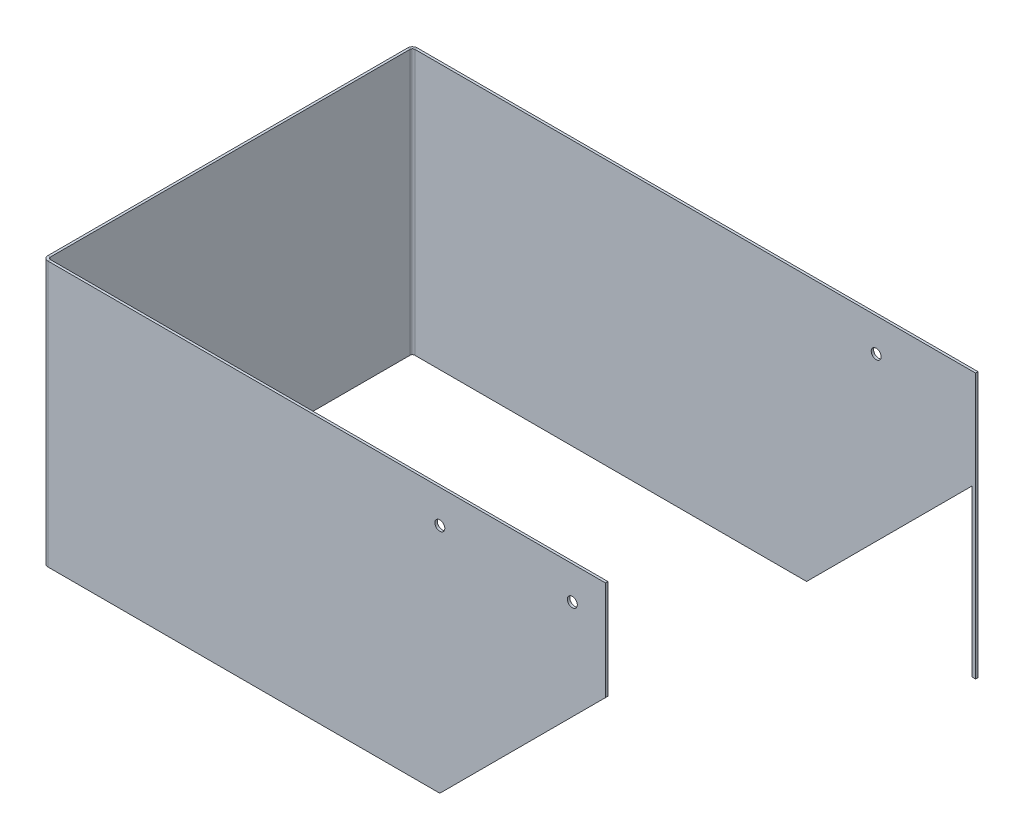
ISO-10303-21;
HEADER;
FILE_DESCRIPTION(('STEP AP214'),'2;1');
FILE_NAME('part.step','',(''),(''),'','','');
FILE_SCHEMA(('AUTOMOTIVE_DESIGN { 1 0 10303 214 1 1 1 1 }'));
ENDSEC;
DATA;
#1=APPLICATION_CONTEXT('core data for automotive mechanical design processes');
#2=APPLICATION_PROTOCOL_DEFINITION('international standard','automotive_design',2000,#1);
#3=PRODUCT_CONTEXT('',#1,'mechanical');
#4=PRODUCT('Part','Part','',(#3));
#5=PRODUCT_RELATED_PRODUCT_CATEGORY('part','',(#4));
#6=PRODUCT_DEFINITION_FORMATION('','',#4);
#7=PRODUCT_DEFINITION_CONTEXT('part definition',#1,'design');
#8=PRODUCT_DEFINITION('design','',#6,#7);
#9=PRODUCT_DEFINITION_SHAPE('','',#8);
#10=(LENGTH_UNIT() NAMED_UNIT(*) SI_UNIT(.MILLI.,.METRE.));
#11=(NAMED_UNIT(*) PLANE_ANGLE_UNIT() SI_UNIT($,.RADIAN.));
#12=(NAMED_UNIT(*) SI_UNIT($,.STERADIAN.) SOLID_ANGLE_UNIT());
#13=UNCERTAINTY_MEASURE_WITH_UNIT(LENGTH_MEASURE(1.E-05),#10,'distance_accuracy_value','');
#14=(GEOMETRIC_REPRESENTATION_CONTEXT(3) GLOBAL_UNCERTAINTY_ASSIGNED_CONTEXT((#13)) GLOBAL_UNIT_ASSIGNED_CONTEXT((#10,
#11,#12)) REPRESENTATION_CONTEXT('',''));
#15=CARTESIAN_POINT('',(0.,0.,0.));
#16=DIRECTION('',(0.,0.,1.));
#17=DIRECTION('',(1.,0.,0.));
#18=AXIS2_PLACEMENT_3D('',#15,#16,#17);
#19=CARTESIAN_POINT('',(-0.7366,0.,-54.3));
#20=DIRECTION('',(0.,-1.,0.));
#21=DIRECTION('',(0.,0.,-1.));
#22=AXIS2_PLACEMENT_3D('',#19,#20,#21);
#23=PLANE('',#22);
#24=DIRECTION('',(0.,0.,1.));
#25=VECTOR('',#24,1.);
#26=CARTESIAN_POINT('',(119.,0.,-55.7366));
#27=LINE('',#26,#25);
#28=CARTESIAN_POINT('',(119.,0.,-55.7366));
#29=VERTEX_POINT('',#28);
#30=CARTESIAN_POINT('',(119.,0.,-55.));
#31=VERTEX_POINT('',#30);
#32=EDGE_CURVE('E152',#29,#31,#27,.T.);
#33=ORIENTED_EDGE('',*,*,#32,.T.);
#34=DIRECTION('',(-1.,0.,0.));
#35=VECTOR('',#34,1.);
#36=CARTESIAN_POINT('',(170.,0.,-55.));
#37=LINE('',#36,#35);
#38=CARTESIAN_POINT('',(0.700000000000006,0.,-55.));
#39=VERTEX_POINT('',#38);
#40=EDGE_CURVE('E282',#31,#39,#37,.T.);
#41=ORIENTED_EDGE('',*,*,#40,.T.);
#42=DIRECTION('',(0.,0.,-1.));
#43=VECTOR('',#42,1.);
#44=CARTESIAN_POINT('',(0.700000000000006,0.,-55.));
#45=LINE('',#44,#43);
#46=CARTESIAN_POINT('',(0.700000000000009,0.,-55.7366));
#47=VERTEX_POINT('',#46);
#48=EDGE_CURVE('E172',#39,#47,#45,.T.);
#49=ORIENTED_EDGE('',*,*,#48,.T.);
#50=DIRECTION('',(-1.,0.,0.));
#51=VECTOR('',#50,1.);
#52=CARTESIAN_POINT('',(170.,0.,-55.7366));
#53=LINE('',#52,#51);
#54=EDGE_CURVE('E166',#29,#47,#53,.T.);
#55=ORIENTED_EDGE('',*,*,#54,.F.);
#56=EDGE_LOOP('',(#33,#41,#49,#55));
#57=FACE_BOUND('',#56,.T.);
#58=ADVANCED_FACE('F41',(#57),#23,.T.);
#59=CARTESIAN_POINT('',(0.,80.,-54.3));
#60=DIRECTION('',(0.,1.,0.));
#61=DIRECTION('',(0.,0.,1.));
#62=AXIS2_PLACEMENT_3D('',#59,#60,#61);
#63=PLANE('',#62);
#64=DIRECTION('',(-1.,0.,0.));
#65=VECTOR('',#64,1.);
#66=CARTESIAN_POINT('',(0.,80.,-54.3));
#67=LINE('',#66,#65);
#68=CARTESIAN_POINT('',(0.,80.,-54.3));
#69=VERTEX_POINT('',#68);
#70=CARTESIAN_POINT('',(-0.7366,80.,-54.3));
#71=VERTEX_POINT('',#70);
#72=EDGE_CURVE('E49',#69,#71,#67,.T.);
#73=ORIENTED_EDGE('',*,*,#72,.F.);
#74=CARTESIAN_POINT('',(0.700000000000003,80.,-54.3));
#75=DIRECTION('',(0.,-1.,0.));
#76=DIRECTION('',(0.,0.,-1.));
#77=AXIS2_PLACEMENT_3D('',#74,#75,#76);
#78=CIRCLE('',#77,0.7);
#79=CARTESIAN_POINT('',(0.700000000000006,80.,-55.));
#80=VERTEX_POINT('',#79);
#81=EDGE_CURVE('E300',#80,#69,#78,.F.);
#82=ORIENTED_EDGE('',*,*,#81,.F.);
#83=DIRECTION('',(0.,0.,1.));
#84=VECTOR('',#83,1.);
#85=CARTESIAN_POINT('',(0.700000000000009,80.,-55.7366));
#86=LINE('',#85,#84);
#87=CARTESIAN_POINT('',(0.700000000000009,80.,-55.7366));
#88=VERTEX_POINT('',#87);
#89=EDGE_CURVE('E237',#88,#80,#86,.T.);
#90=ORIENTED_EDGE('',*,*,#89,.F.);
#91=CARTESIAN_POINT('',(0.700000000000003,80.,-54.3));
#92=DIRECTION('',(0.,1.,0.));
#93=DIRECTION('',(1.,0.,0.));
#94=AXIS2_PLACEMENT_3D('',#91,#92,#93);
#95=CIRCLE('',#94,1.4366);
#96=EDGE_CURVE('E252',#88,#71,#95,.T.);
#97=ORIENTED_EDGE('',*,*,#96,.T.);
#98=EDGE_LOOP('',(#73,#82,#90,#97));
#99=FACE_BOUND('',#98,.T.);
#100=ADVANCED_FACE('F43',(#99),#63,.T.);
#101=CARTESIAN_POINT('',(0.700000000000009,80.,-55.7366));
#102=DIRECTION('',(0.,1.,0.));
#103=DIRECTION('',(0.,0.,1.));
#104=AXIS2_PLACEMENT_3D('',#101,#102,#103);
#105=PLANE('',#104);
#106=DIRECTION('',(0.,0.,1.));
#107=VECTOR('',#106,1.);
#108=CARTESIAN_POINT('',(0.,80.,0.));
#109=LINE('',#108,#107);
#110=CARTESIAN_POINT('',(0.,80.,54.3));
#111=VERTEX_POINT('',#110);
#112=EDGE_CURVE('E247',#69,#111,#109,.T.);
#113=ORIENTED_EDGE('',*,*,#112,.F.);
#114=ORIENTED_EDGE('',*,*,#72,.T.);
#115=DIRECTION('',(0.,0.,1.));
#116=VECTOR('',#115,1.);
#117=CARTESIAN_POINT('',(-0.7366,80.,-55.));
#118=LINE('',#117,#116);
#119=CARTESIAN_POINT('',(-0.736600000000009,80.,54.3));
#120=VERTEX_POINT('',#119);
#121=EDGE_CURVE('E244',#71,#120,#118,.T.);
#122=ORIENTED_EDGE('',*,*,#121,.T.);
#123=DIRECTION('',(1.,0.,0.));
#124=VECTOR('',#123,1.);
#125=CARTESIAN_POINT('',(-0.736600000000009,80.,54.3));
#126=LINE('',#125,#124);
#127=EDGE_CURVE('E230',#120,#111,#126,.T.);
#128=ORIENTED_EDGE('',*,*,#127,.T.);
#129=EDGE_LOOP('',(#113,#114,#122,#128));
#130=FACE_BOUND('',#129,.T.);
#131=ADVANCED_FACE('F242',(#130),#105,.T.);
#132=CARTESIAN_POINT('',(0.700000000000006,0.,-55.));
#133=DIRECTION('',(0.,-1.,0.));
#134=DIRECTION('',(0.,0.,-1.));
#135=AXIS2_PLACEMENT_3D('',#132,#133,#134);
#136=PLANE('',#135);
#137=ORIENTED_EDGE('',*,*,#48,.F.);
#138=CARTESIAN_POINT('',(0.700000000000003,0.,-54.3));
#139=DIRECTION('',(0.,-1.,0.));
#140=DIRECTION('',(0.,0.,-1.));
#141=AXIS2_PLACEMENT_3D('',#138,#139,#140);
#142=CIRCLE('',#141,0.7);
#143=CARTESIAN_POINT('',(0.,0.,-54.3));
#144=VERTEX_POINT('',#143);
#145=EDGE_CURVE('E280',#39,#144,#142,.F.);
#146=ORIENTED_EDGE('',*,*,#145,.T.);
#147=DIRECTION('',(1.,0.,0.));
#148=VECTOR('',#147,1.);
#149=CARTESIAN_POINT('',(-0.7366,0.,-54.3));
#150=LINE('',#149,#148);
#151=CARTESIAN_POINT('',(-0.7366,0.,-54.3));
#152=VERTEX_POINT('',#151);
#153=EDGE_CURVE('E234',#152,#144,#150,.T.);
#154=ORIENTED_EDGE('',*,*,#153,.F.);
#155=CARTESIAN_POINT('',(0.700000000000003,0.,-54.3));
#156=DIRECTION('',(0.,1.,0.));
#157=DIRECTION('',(1.,0.,0.));
#158=AXIS2_PLACEMENT_3D('',#155,#156,#157);
#159=CIRCLE('',#158,1.4366);
#160=EDGE_CURVE('E177',#47,#152,#159,.T.);
#161=ORIENTED_EDGE('',*,*,#160,.F.);
#162=EDGE_LOOP('',(#137,#146,#154,#161));
#163=FACE_BOUND('',#162,.T.);
#164=ADVANCED_FACE('F289',(#163),#136,.T.);
#165=DIRECTION('',(0.,0.,1.));
#166=VECTOR('',#165,1.);
#167=CARTESIAN_POINT('',(169.,0.,-55.7366));
#168=LINE('',#167,#166);
#169=CARTESIAN_POINT('',(169.,0.,-55.7366));
#170=VERTEX_POINT('',#169);
#171=CARTESIAN_POINT('',(169.,0.,-55.));
#172=VERTEX_POINT('',#171);
#173=EDGE_CURVE('E159',#170,#172,#168,.T.);
#174=ORIENTED_EDGE('',*,*,#173,.F.);
#175=CARTESIAN_POINT('',(170.,0.,-55.7366));
#176=VERTEX_POINT('',#175);
#177=EDGE_CURVE('E174',#176,#170,#53,.T.);
#178=ORIENTED_EDGE('',*,*,#177,.F.);
#179=DIRECTION('',(0.,0.,1.));
#180=VECTOR('',#179,1.);
#181=CARTESIAN_POINT('',(170.,0.,-55.7366));
#182=LINE('',#181,#180);
#183=CARTESIAN_POINT('',(170.,0.,-55.));
#184=VERTEX_POINT('',#183);
#185=EDGE_CURVE('E175',#176,#184,#182,.T.);
#186=ORIENTED_EDGE('',*,*,#185,.T.);
#187=EDGE_CURVE('E179',#184,#172,#37,.T.);
#188=ORIENTED_EDGE('',*,*,#187,.T.);
#189=EDGE_LOOP('',(#174,#178,#186,#188));
#190=FACE_BOUND('',#189,.T.);
#191=ADVANCED_FACE('F356',(#190),#23,.T.);
#192=CARTESIAN_POINT('',(0.699999999999992,80.,55.));
#193=DIRECTION('',(0.,1.,0.));
#194=DIRECTION('',(0.,0.,1.));
#195=AXIS2_PLACEMENT_3D('',#192,#193,#194);
#196=PLANE('',#195);
#197=DIRECTION('',(0.,0.,1.));
#198=VECTOR('',#197,1.);
#199=CARTESIAN_POINT('',(0.699999999999992,80.,55.));
#200=LINE('',#199,#198);
#201=CARTESIAN_POINT('',(0.699999999999992,80.,55.));
#202=VERTEX_POINT('',#201);
#203=CARTESIAN_POINT('',(0.699999999999992,80.,55.7366));
#204=VERTEX_POINT('',#203);
#205=EDGE_CURVE('E232',#202,#204,#200,.T.);
#206=ORIENTED_EDGE('',*,*,#205,.F.);
#207=CARTESIAN_POINT('',(0.699999999999992,80.,54.3));
#208=DIRECTION('',(0.,-1.,0.));
#209=DIRECTION('',(0.,0.,-1.));
#210=AXIS2_PLACEMENT_3D('',#207,#208,#209);
#211=CIRCLE('',#210,0.7);
#212=EDGE_CURVE('E323',#111,#202,#211,.F.);
#213=ORIENTED_EDGE('',*,*,#212,.F.);
#214=ORIENTED_EDGE('',*,*,#127,.F.);
#215=CARTESIAN_POINT('',(0.699999999999992,80.,54.3));
#216=DIRECTION('',(0.,1.,0.));
#217=DIRECTION('',(1.,0.,0.));
#218=AXIS2_PLACEMENT_3D('',#215,#216,#217);
#219=CIRCLE('',#218,1.4366);
#220=EDGE_CURVE('E196',#120,#204,#219,.T.);
#221=ORIENTED_EDGE('',*,*,#220,.T.);
#222=EDGE_LOOP('',(#206,#213,#214,#221));
#223=FACE_BOUND('',#222,.T.);
#224=ADVANCED_FACE('F408',(#223),#196,.T.);
#225=CARTESIAN_POINT('',(-0.736600000000009,80.,54.3));
#226=DIRECTION('',(0.,1.,0.));
#227=DIRECTION('',(0.,0.,1.));
#228=AXIS2_PLACEMENT_3D('',#225,#226,#227);
#229=PLANE('',#228);
#230=DIRECTION('',(1.,0.,0.));
#231=VECTOR('',#230,1.);
#232=CARTESIAN_POINT('',(0.,80.,55.));
#233=LINE('',#232,#231);
#234=CARTESIAN_POINT('',(169.,80.,55.));
#235=VERTEX_POINT('',#234);
#236=EDGE_CURVE('E341',#202,#235,#233,.T.);
#237=ORIENTED_EDGE('',*,*,#236,.F.);
#238=ORIENTED_EDGE('',*,*,#205,.T.);
#239=DIRECTION('',(1.,0.,0.));
#240=VECTOR('',#239,1.);
#241=CARTESIAN_POINT('',(0.,80.,55.7366));
#242=LINE('',#241,#240);
#243=CARTESIAN_POINT('',(169.,80.,55.7366));
#244=VERTEX_POINT('',#243);
#245=EDGE_CURVE('E191',#204,#244,#242,.T.);
#246=ORIENTED_EDGE('',*,*,#245,.T.);
#247=DIRECTION('',(0.,0.,1.));
#248=VECTOR('',#247,1.);
#249=CARTESIAN_POINT('',(169.,80.,55.));
#250=LINE('',#249,#248);
#251=EDGE_CURVE('E338',#235,#244,#250,.T.);
#252=ORIENTED_EDGE('',*,*,#251,.F.);
#253=EDGE_LOOP('',(#237,#238,#246,#252));
#254=FACE_BOUND('',#253,.T.);
#255=ADVANCED_FACE('F413',(#254),#229,.T.);
#256=CARTESIAN_POINT('',(0.,0.,54.3));
#257=DIRECTION('',(0.,-1.,0.));
#258=DIRECTION('',(0.,0.,-1.));
#259=AXIS2_PLACEMENT_3D('',#256,#257,#258);
#260=PLANE('',#259);
#261=DIRECTION('',(-1.,0.,0.));
#262=VECTOR('',#261,1.);
#263=CARTESIAN_POINT('',(0.,0.,54.3));
#264=LINE('',#263,#262);
#265=CARTESIAN_POINT('',(0.,0.,54.3));
#266=VERTEX_POINT('',#265);
#267=CARTESIAN_POINT('',(-0.736600000000009,0.,54.3));
#268=VERTEX_POINT('',#267);
#269=EDGE_CURVE('E228',#266,#268,#264,.T.);
#270=ORIENTED_EDGE('',*,*,#269,.F.);
#271=CARTESIAN_POINT('',(0.699999999999992,0.,54.3));
#272=DIRECTION('',(0.,-1.,0.));
#273=DIRECTION('',(0.,0.,-1.));
#274=AXIS2_PLACEMENT_3D('',#271,#272,#273);
#275=CIRCLE('',#274,0.7);
#276=CARTESIAN_POINT('',(0.699999999999992,0.,55.));
#277=VERTEX_POINT('',#276);
#278=EDGE_CURVE('E274',#266,#277,#275,.F.);
#279=ORIENTED_EDGE('',*,*,#278,.T.);
#280=DIRECTION('',(0.,0.,-1.));
#281=VECTOR('',#280,1.);
#282=CARTESIAN_POINT('',(0.699999999999992,0.,55.7366));
#283=LINE('',#282,#281);
#284=CARTESIAN_POINT('',(0.699999999999992,0.,55.7366));
#285=VERTEX_POINT('',#284);
#286=EDGE_CURVE('E226',#285,#277,#283,.T.);
#287=ORIENTED_EDGE('',*,*,#286,.F.);
#288=CARTESIAN_POINT('',(0.699999999999992,0.,54.3));
#289=DIRECTION('',(0.,1.,0.));
#290=DIRECTION('',(1.,0.,0.));
#291=AXIS2_PLACEMENT_3D('',#288,#289,#290);
#292=CIRCLE('',#291,1.4366);
#293=EDGE_CURVE('E188',#268,#285,#292,.T.);
#294=ORIENTED_EDGE('',*,*,#293,.F.);
#295=EDGE_LOOP('',(#270,#279,#287,#294));
#296=FACE_BOUND('',#295,.T.);
#297=ADVANCED_FACE('F313',(#296),#260,.T.);
#298=CARTESIAN_POINT('',(0.699999999999992,0.,55.7366));
#299=DIRECTION('',(0.,-1.,0.));
#300=DIRECTION('',(0.,0.,-1.));
#301=AXIS2_PLACEMENT_3D('',#298,#299,#300);
#302=PLANE('',#301);
#303=DIRECTION('',(0.,0.,1.));
#304=VECTOR('',#303,1.);
#305=CARTESIAN_POINT('',(0.,0.,-55.));
#306=LINE('',#305,#304);
#307=EDGE_CURVE('E277',#144,#266,#306,.T.);
#308=ORIENTED_EDGE('',*,*,#307,.T.);
#309=ORIENTED_EDGE('',*,*,#269,.T.);
#310=DIRECTION('',(0.,0.,1.));
#311=VECTOR('',#310,1.);
#312=CARTESIAN_POINT('',(-0.7366,0.,0.));
#313=LINE('',#312,#311);
#314=EDGE_CURVE('E185',#152,#268,#313,.T.);
#315=ORIENTED_EDGE('',*,*,#314,.F.);
#316=ORIENTED_EDGE('',*,*,#153,.T.);
#317=EDGE_LOOP('',(#308,#309,#315,#316));
#318=FACE_BOUND('',#317,.T.);
#319=ADVANCED_FACE('F306',(#318),#302,.T.);
#320=CARTESIAN_POINT('',(0.,80.,55.7366));
#321=DIRECTION('',(0.,0.,-1.));
#322=DIRECTION('',(-1.,0.,0.));
#323=AXIS2_PLACEMENT_3D('',#320,#321,#322);
#324=PLANE('',#323);
#325=CARTESIAN_POINT('',(159.,70.,55.7366));
#326=DIRECTION('',(0.,0.,1.));
#327=DIRECTION('',(1.,0.,0.));
#328=AXIS2_PLACEMENT_3D('',#325,#326,#327);
#329=CIRCLE('',#328,1.5);
#330=CARTESIAN_POINT('',(160.5,70.,55.7366));
#331=VERTEX_POINT('',#330);
#332=EDGE_CURVE('E369',#331,#331,#329,.T.);
#333=ORIENTED_EDGE('',*,*,#332,.F.);
#334=EDGE_LOOP('',(#333));
#335=FACE_BOUND('',#334,.T.);
#336=CARTESIAN_POINT('',(119.,70.,55.7366));
#337=DIRECTION('',(0.,0.,1.));
#338=DIRECTION('',(1.,0.,0.));
#339=AXIS2_PLACEMENT_3D('',#336,#337,#338);
#340=CIRCLE('',#339,1.5);
#341=CARTESIAN_POINT('',(120.5,70.,55.7366));
#342=VERTEX_POINT('',#341);
#343=EDGE_CURVE('E370',#342,#342,#340,.T.);
#344=ORIENTED_EDGE('',*,*,#343,.F.);
#345=EDGE_LOOP('',(#344));
#346=FACE_BOUND('',#345,.T.);
#347=DIRECTION('',(1.,0.,0.));
#348=VECTOR('',#347,1.);
#349=CARTESIAN_POINT('',(0.,0.,55.7366));
#350=LINE('',#349,#348);
#351=CARTESIAN_POINT('',(119.,0.,55.7366));
#352=VERTEX_POINT('',#351);
#353=EDGE_CURVE('E268',#285,#352,#350,.T.);
#354=ORIENTED_EDGE('',*,*,#353,.T.);
#355=DIRECTION('',(0.707106781186548,0.707106781186548,0.));
#356=VECTOR('',#355,1.);
#357=CARTESIAN_POINT('',(99.5,-19.5,55.7366));
#358=LINE('',#357,#356);
#359=CARTESIAN_POINT('',(169.,50.,55.7366));
#360=VERTEX_POINT('',#359);
#361=EDGE_CURVE('E63',#352,#360,#358,.T.);
#362=ORIENTED_EDGE('',*,*,#361,.T.);
#363=DIRECTION('',(0.,-1.,0.));
#364=VECTOR('',#363,1.);
#365=CARTESIAN_POINT('',(169.,80.,55.7366));
#366=LINE('',#365,#364);
#367=EDGE_CURVE('E223',#244,#360,#366,.T.);
#368=ORIENTED_EDGE('',*,*,#367,.F.);
#369=ORIENTED_EDGE('',*,*,#245,.F.);
#370=DIRECTION('',(0.,-1.,0.));
#371=VECTOR('',#370,1.);
#372=CARTESIAN_POINT('',(0.699999999999992,80.,55.7366));
#373=LINE('',#372,#371);
#374=EDGE_CURVE('E192',#204,#285,#373,.T.);
#375=ORIENTED_EDGE('',*,*,#374,.T.);
#376=EDGE_LOOP('',(#354,#362,#368,#369,#375));
#377=FACE_BOUND('',#376,.T.);
#378=ADVANCED_FACE('F484',(#335,#346,#377),#324,.F.);
#379=CARTESIAN_POINT('',(169.,80.,55.));
#380=DIRECTION('',(1.,0.,0.));
#381=DIRECTION('',(0.,0.,-1.));
#382=AXIS2_PLACEMENT_3D('',#379,#380,#381);
#383=PLANE('',#382);
#384=DIRECTION('',(0.,0.,1.));
#385=VECTOR('',#384,1.);
#386=CARTESIAN_POINT('',(169.,50.,-55.7366));
#387=LINE('',#386,#385);
#388=CARTESIAN_POINT('',(169.,50.,55.));
#389=VERTEX_POINT('',#388);
#390=EDGE_CURVE('E361',#389,#360,#387,.T.);
#391=ORIENTED_EDGE('',*,*,#390,.F.);
#392=DIRECTION('',(0.,-1.,0.));
#393=VECTOR('',#392,1.);
#394=CARTESIAN_POINT('',(169.,80.,55.));
#395=LINE('',#394,#393);
#396=EDGE_CURVE('E220',#235,#389,#395,.T.);
#397=ORIENTED_EDGE('',*,*,#396,.F.);
#398=ORIENTED_EDGE('',*,*,#251,.T.);
#399=ORIENTED_EDGE('',*,*,#367,.T.);
#400=EDGE_LOOP('',(#391,#397,#398,#399));
#401=FACE_BOUND('',#400,.T.);
#402=ADVANCED_FACE('F495',(#401),#383,.T.);
#403=CARTESIAN_POINT('',(0.,80.,55.));
#404=DIRECTION('',(0.,0.,-1.));
#405=DIRECTION('',(-1.,0.,0.));
#406=AXIS2_PLACEMENT_3D('',#403,#404,#405);
#407=PLANE('',#406);
#408=CARTESIAN_POINT('',(159.,70.,55.));
#409=DIRECTION('',(0.,0.,-1.));
#410=DIRECTION('',(-1.,0.,0.));
#411=AXIS2_PLACEMENT_3D('',#408,#409,#410);
#412=CIRCLE('',#411,1.5);
#413=CARTESIAN_POINT('',(157.5,70.,55.));
#414=VERTEX_POINT('',#413);
#415=EDGE_CURVE('E169',#414,#414,#412,.F.);
#416=ORIENTED_EDGE('',*,*,#415,.T.);
#417=EDGE_LOOP('',(#416));
#418=FACE_BOUND('',#417,.T.);
#419=CARTESIAN_POINT('',(119.,70.,55.));
#420=DIRECTION('',(0.,0.,-1.));
#421=DIRECTION('',(-1.,0.,0.));
#422=AXIS2_PLACEMENT_3D('',#419,#420,#421);
#423=CIRCLE('',#422,1.5);
#424=CARTESIAN_POINT('',(117.5,70.,55.));
#425=VERTEX_POINT('',#424);
#426=EDGE_CURVE('E366',#425,#425,#423,.F.);
#427=ORIENTED_EDGE('',*,*,#426,.T.);
#428=EDGE_LOOP('',(#427));
#429=FACE_BOUND('',#428,.T.);
#430=DIRECTION('',(0.707106781186548,0.707106781186548,0.));
#431=VECTOR('',#430,1.);
#432=CARTESIAN_POINT('',(99.5,-19.5,55.));
#433=LINE('',#432,#431);
#434=CARTESIAN_POINT('',(119.,0.,55.));
#435=VERTEX_POINT('',#434);
#436=EDGE_CURVE('E329',#435,#389,#433,.T.);
#437=ORIENTED_EDGE('',*,*,#436,.F.);
#438=DIRECTION('',(1.,0.,0.));
#439=VECTOR('',#438,1.);
#440=CARTESIAN_POINT('',(0.,0.,55.));
#441=LINE('',#440,#439);
#442=EDGE_CURVE('E271',#277,#435,#441,.T.);
#443=ORIENTED_EDGE('',*,*,#442,.F.);
#444=DIRECTION('',(0.,-1.,0.));
#445=VECTOR('',#444,1.);
#446=CARTESIAN_POINT('',(0.699999999999992,80.,55.));
#447=LINE('',#446,#445);
#448=EDGE_CURVE('E217',#202,#277,#447,.T.);
#449=ORIENTED_EDGE('',*,*,#448,.F.);
#450=ORIENTED_EDGE('',*,*,#236,.T.);
#451=ORIENTED_EDGE('',*,*,#396,.T.);
#452=EDGE_LOOP('',(#437,#443,#449,#450,#451));
#453=FACE_BOUND('',#452,.T.);
#454=ADVANCED_FACE('F328',(#418,#429,#453),#407,.T.);
#455=CARTESIAN_POINT('',(0.699999999999992,80.,54.3));
#456=DIRECTION('',(0.,-1.,0.));
#457=DIRECTION('',(0.,0.,-1.));
#458=AXIS2_PLACEMENT_3D('',#455,#456,#457);
#459=CYLINDRICAL_SURFACE('',#458,0.7);
#460=ORIENTED_EDGE('',*,*,#278,.F.);
#461=DIRECTION('',(0.,-1.,0.));
#462=VECTOR('',#461,1.);
#463=CARTESIAN_POINT('',(0.,80.,54.3));
#464=LINE('',#463,#462);
#465=EDGE_CURVE('E214',#111,#266,#464,.T.);
#466=ORIENTED_EDGE('',*,*,#465,.F.);
#467=ORIENTED_EDGE('',*,*,#212,.T.);
#468=ORIENTED_EDGE('',*,*,#448,.T.);
#469=EDGE_LOOP('',(#460,#466,#467,#468));
#470=FACE_BOUND('',#469,.T.);
#471=ADVANCED_FACE('F321',(#470),#459,.F.);
#472=CARTESIAN_POINT('',(0.,80.,-55.));
#473=DIRECTION('',(1.,0.,0.));
#474=DIRECTION('',(0.,0.,-1.));
#475=AXIS2_PLACEMENT_3D('',#472,#473,#474);
#476=PLANE('',#475);
#477=ORIENTED_EDGE('',*,*,#307,.F.);
#478=DIRECTION('',(0.,-1.,0.));
#479=VECTOR('',#478,1.);
#480=CARTESIAN_POINT('',(0.,80.,-54.3));
#481=LINE('',#480,#479);
#482=EDGE_CURVE('E211',#69,#144,#481,.T.);
#483=ORIENTED_EDGE('',*,*,#482,.F.);
#484=ORIENTED_EDGE('',*,*,#112,.T.);
#485=ORIENTED_EDGE('',*,*,#465,.T.);
#486=EDGE_LOOP('',(#477,#483,#484,#485));
#487=FACE_BOUND('',#486,.T.);
#488=ADVANCED_FACE('F302',(#487),#476,.T.);
#489=CARTESIAN_POINT('',(0.700000000000003,80.,-54.3));
#490=DIRECTION('',(0.,-1.,0.));
#491=DIRECTION('',(0.,0.,-1.));
#492=AXIS2_PLACEMENT_3D('',#489,#490,#491);
#493=CYLINDRICAL_SURFACE('',#492,0.7);
#494=ORIENTED_EDGE('',*,*,#145,.F.);
#495=DIRECTION('',(0.,-1.,0.));
#496=VECTOR('',#495,1.);
#497=CARTESIAN_POINT('',(0.700000000000006,80.,-55.));
#498=LINE('',#497,#496);
#499=EDGE_CURVE('E208',#80,#39,#498,.T.);
#500=ORIENTED_EDGE('',*,*,#499,.F.);
#501=ORIENTED_EDGE('',*,*,#81,.T.);
#502=ORIENTED_EDGE('',*,*,#482,.T.);
#503=EDGE_LOOP('',(#494,#500,#501,#502));
#504=FACE_BOUND('',#503,.T.);
#505=ADVANCED_FACE('F298',(#504),#493,.F.);
#506=CARTESIAN_POINT('',(170.,80.,-55.));
#507=DIRECTION('',(0.,0.,1.));
#508=DIRECTION('',(1.,0.,0.));
#509=AXIS2_PLACEMENT_3D('',#506,#507,#508);
#510=PLANE('',#509);
#511=CARTESIAN_POINT('',(140.,70.,-55.));
#512=DIRECTION('',(0.,0.,1.));
#513=DIRECTION('',(1.,0.,0.));
#514=AXIS2_PLACEMENT_3D('',#511,#512,#513);
#515=CIRCLE('',#514,1.5);
#516=CARTESIAN_POINT('',(141.5,70.,-55.));
#517=VERTEX_POINT('',#516);
#518=EDGE_CURVE('E373',#517,#517,#515,.T.);
#519=ORIENTED_EDGE('',*,*,#518,.F.);
#520=EDGE_LOOP('',(#519));
#521=FACE_BOUND('',#520,.T.);
#522=DIRECTION('',(-0.707106781186548,-0.707106781186548,0.));
#523=VECTOR('',#522,1.);
#524=CARTESIAN_POINT('',(184.5,65.5,-55.));
#525=LINE('',#524,#523);
#526=CARTESIAN_POINT('',(169.,50.,-55.));
#527=VERTEX_POINT('',#526);
#528=EDGE_CURVE('E155',#527,#31,#525,.T.);
#529=ORIENTED_EDGE('',*,*,#528,.F.);
#530=DIRECTION('',(0.,1.,0.));
#531=VECTOR('',#530,1.);
#532=CARTESIAN_POINT('',(169.,80.,-55.));
#533=LINE('',#532,#531);
#534=EDGE_CURVE('E333',#172,#527,#533,.T.);
#535=ORIENTED_EDGE('',*,*,#534,.F.);
#536=ORIENTED_EDGE('',*,*,#187,.F.);
#537=DIRECTION('',(0.,-1.,0.));
#538=VECTOR('',#537,1.);
#539=CARTESIAN_POINT('',(170.,80.,-55.));
#540=LINE('',#539,#538);
#541=CARTESIAN_POINT('',(170.,80.,-55.));
#542=VERTEX_POINT('',#541);
#543=EDGE_CURVE('E206',#542,#184,#540,.T.);
#544=ORIENTED_EDGE('',*,*,#543,.F.);
#545=DIRECTION('',(-1.,0.,0.));
#546=VECTOR('',#545,1.);
#547=CARTESIAN_POINT('',(170.,80.,-55.));
#548=LINE('',#547,#546);
#549=EDGE_CURVE('E295',#542,#80,#548,.T.);
#550=ORIENTED_EDGE('',*,*,#549,.T.);
#551=ORIENTED_EDGE('',*,*,#499,.T.);
#552=ORIENTED_EDGE('',*,*,#40,.F.);
#553=EDGE_LOOP('',(#529,#535,#536,#544,#550,#551,#552));
#554=FACE_BOUND('',#553,.T.);
#555=ADVANCED_FACE('F293',(#521,#554),#510,.T.);
#556=CARTESIAN_POINT('',(170.,80.,-55.7366));
#557=DIRECTION('',(1.,0.,0.));
#558=DIRECTION('',(0.,0.,-1.));
#559=AXIS2_PLACEMENT_3D('',#556,#557,#558);
#560=PLANE('',#559);
#561=ORIENTED_EDGE('',*,*,#185,.F.);
#562=DIRECTION('',(0.,-1.,0.));
#563=VECTOR('',#562,1.);
#564=CARTESIAN_POINT('',(170.,80.,-55.7366));
#565=LINE('',#564,#563);
#566=CARTESIAN_POINT('',(170.,80.,-55.7366));
#567=VERTEX_POINT('',#566);
#568=EDGE_CURVE('E204',#567,#176,#565,.T.);
#569=ORIENTED_EDGE('',*,*,#568,.F.);
#570=DIRECTION('',(0.,0.,1.));
#571=VECTOR('',#570,1.);
#572=CARTESIAN_POINT('',(170.,80.,-55.7366));
#573=LINE('',#572,#571);
#574=EDGE_CURVE('E347',#567,#542,#573,.T.);
#575=ORIENTED_EDGE('',*,*,#574,.T.);
#576=ORIENTED_EDGE('',*,*,#543,.T.);
#577=EDGE_LOOP('',(#561,#569,#575,#576));
#578=FACE_BOUND('',#577,.T.);
#579=ADVANCED_FACE('F357',(#578),#560,.T.);
#580=CARTESIAN_POINT('',(170.,80.,-55.7366));
#581=DIRECTION('',(0.,0.,1.));
#582=DIRECTION('',(1.,0.,0.));
#583=AXIS2_PLACEMENT_3D('',#580,#581,#582);
#584=PLANE('',#583);
#585=CARTESIAN_POINT('',(140.,70.,-55.7366));
#586=DIRECTION('',(0.,0.,1.));
#587=DIRECTION('',(1.,0.,0.));
#588=AXIS2_PLACEMENT_3D('',#585,#586,#587);
#589=CIRCLE('',#588,1.5);
#590=CARTESIAN_POINT('',(141.5,70.,-55.7366));
#591=VERTEX_POINT('',#590);
#592=EDGE_CURVE('E380',#591,#591,#589,.T.);
#593=ORIENTED_EDGE('',*,*,#592,.T.);
#594=EDGE_LOOP('',(#593));
#595=FACE_BOUND('',#594,.T.);
#596=DIRECTION('',(0.,1.,0.));
#597=VECTOR('',#596,1.);
#598=CARTESIAN_POINT('',(169.,50.,-55.7366));
#599=LINE('',#598,#597);
#600=CARTESIAN_POINT('',(169.,50.,-55.7366));
#601=VERTEX_POINT('',#600);
#602=EDGE_CURVE('E160',#170,#601,#599,.T.);
#603=ORIENTED_EDGE('',*,*,#602,.T.);
#604=DIRECTION('',(-0.707106781186547,-0.707106781186547,0.));
#605=VECTOR('',#604,1.);
#606=CARTESIAN_POINT('',(119.,0.,-55.7366));
#607=LINE('',#606,#605);
#608=EDGE_CURVE('E56',#601,#29,#607,.T.);
#609=ORIENTED_EDGE('',*,*,#608,.T.);
#610=ORIENTED_EDGE('',*,*,#54,.T.);
#611=DIRECTION('',(0.,-1.,0.));
#612=VECTOR('',#611,1.);
#613=CARTESIAN_POINT('',(0.700000000000009,80.,-55.7366));
#614=LINE('',#613,#612);
#615=EDGE_CURVE('E202',#88,#47,#614,.T.);
#616=ORIENTED_EDGE('',*,*,#615,.F.);
#617=DIRECTION('',(-1.,0.,0.));
#618=VECTOR('',#617,1.);
#619=CARTESIAN_POINT('',(170.,80.,-55.7366));
#620=LINE('',#619,#618);
#621=EDGE_CURVE('E256',#567,#88,#620,.T.);
#622=ORIENTED_EDGE('',*,*,#621,.F.);
#623=ORIENTED_EDGE('',*,*,#568,.T.);
#624=ORIENTED_EDGE('',*,*,#177,.T.);
#625=EDGE_LOOP('',(#603,#609,#610,#616,#622,#623,#624));
#626=FACE_BOUND('',#625,.T.);
#627=ADVANCED_FACE('F164',(#595,#626),#584,.F.);
#628=CARTESIAN_POINT('',(0.700000000000003,80.,-54.3));
#629=DIRECTION('',(0.,-1.,0.));
#630=DIRECTION('',(0.,0.,-1.));
#631=AXIS2_PLACEMENT_3D('',#628,#629,#630);
#632=CYLINDRICAL_SURFACE('',#631,1.4366);
#633=ORIENTED_EDGE('',*,*,#160,.T.);
#634=DIRECTION('',(0.,-1.,0.));
#635=VECTOR('',#634,1.);
#636=CARTESIAN_POINT('',(-0.7366,80.,-54.3));
#637=LINE('',#636,#635);
#638=EDGE_CURVE('E199',#71,#152,#637,.T.);
#639=ORIENTED_EDGE('',*,*,#638,.F.);
#640=ORIENTED_EDGE('',*,*,#96,.F.);
#641=ORIENTED_EDGE('',*,*,#615,.T.);
#642=EDGE_LOOP('',(#633,#639,#640,#641));
#643=FACE_BOUND('',#642,.T.);
#644=ADVANCED_FACE('F258',(#643),#632,.T.);
#645=CARTESIAN_POINT('',(-0.7366,80.,0.));
#646=DIRECTION('',(1.,0.,0.));
#647=DIRECTION('',(0.,0.,-1.));
#648=AXIS2_PLACEMENT_3D('',#645,#646,#647);
#649=PLANE('',#648);
#650=ORIENTED_EDGE('',*,*,#314,.T.);
#651=DIRECTION('',(0.,-1.,0.));
#652=VECTOR('',#651,1.);
#653=CARTESIAN_POINT('',(-0.736600000000009,80.,54.3));
#654=LINE('',#653,#652);
#655=EDGE_CURVE('E195',#120,#268,#654,.T.);
#656=ORIENTED_EDGE('',*,*,#655,.F.);
#657=ORIENTED_EDGE('',*,*,#121,.F.);
#658=ORIENTED_EDGE('',*,*,#638,.T.);
#659=EDGE_LOOP('',(#650,#656,#657,#658));
#660=FACE_BOUND('',#659,.T.);
#661=ADVANCED_FACE('F261',(#660),#649,.F.);
#662=CARTESIAN_POINT('',(0.699999999999992,80.,54.3));
#663=DIRECTION('',(0.,-1.,0.));
#664=DIRECTION('',(0.,0.,-1.));
#665=AXIS2_PLACEMENT_3D('',#662,#663,#664);
#666=CYLINDRICAL_SURFACE('',#665,1.4366);
#667=ORIENTED_EDGE('',*,*,#293,.T.);
#668=ORIENTED_EDGE('',*,*,#374,.F.);
#669=ORIENTED_EDGE('',*,*,#220,.F.);
#670=ORIENTED_EDGE('',*,*,#655,.T.);
#671=EDGE_LOOP('',(#667,#668,#669,#670));
#672=FACE_BOUND('',#671,.T.);
#673=ADVANCED_FACE('F310',(#672),#666,.T.);
#674=CARTESIAN_POINT('',(0.699999999999992,80.,54.3));
#675=DIRECTION('',(0.,-1.,0.));
#676=DIRECTION('',(-1.,0.,0.));
#677=AXIS2_PLACEMENT_3D('',#674,#675,#676);
#678=PLANE('',#677);
#679=ORIENTED_EDGE('',*,*,#621,.T.);
#680=ORIENTED_EDGE('',*,*,#89,.T.);
#681=ORIENTED_EDGE('',*,*,#549,.F.);
#682=ORIENTED_EDGE('',*,*,#574,.F.);
#683=EDGE_LOOP('',(#679,#680,#681,#682));
#684=FACE_BOUND('',#683,.T.);
#685=ADVANCED_FACE('F352',(#684),#678,.F.);
#686=CARTESIAN_POINT('',(0.699999999999992,0.,54.3));
#687=DIRECTION('',(0.,-1.,0.));
#688=DIRECTION('',(-1.,0.,0.));
#689=AXIS2_PLACEMENT_3D('',#686,#687,#688);
#690=PLANE('',#689);
#691=DIRECTION('',(0.,0.,-1.));
#692=VECTOR('',#691,1.);
#693=CARTESIAN_POINT('',(119.,0.,54.3));
#694=LINE('',#693,#692);
#695=EDGE_CURVE('E11',#352,#435,#694,.T.);
#696=ORIENTED_EDGE('',*,*,#695,.F.);
#697=ORIENTED_EDGE('',*,*,#353,.F.);
#698=ORIENTED_EDGE('',*,*,#286,.T.);
#699=ORIENTED_EDGE('',*,*,#442,.T.);
#700=EDGE_LOOP('',(#696,#697,#698,#699));
#701=FACE_BOUND('',#700,.T.);
#702=ADVANCED_FACE('F316',(#701),#690,.T.);
#703=CARTESIAN_POINT('',(119.,0.,-55.7366));
#704=DIRECTION('',(-0.707106781186547,0.707106781186547,0.));
#705=DIRECTION('',(-0.707106781186548,-0.707106781186548,0.));
#706=AXIS2_PLACEMENT_3D('',#703,#704,#705);
#707=PLANE('',#706);
#708=ORIENTED_EDGE('',*,*,#695,.T.);
#709=ORIENTED_EDGE('',*,*,#436,.T.);
#710=ORIENTED_EDGE('',*,*,#390,.T.);
#711=ORIENTED_EDGE('',*,*,#361,.F.);
#712=EDGE_LOOP('',(#708,#709,#710,#711));
#713=FACE_BOUND('',#712,.T.);
#714=ADVANCED_FACE('F614',(#713),#707,.F.);
#715=ORIENTED_EDGE('',*,*,#528,.T.);
#716=ORIENTED_EDGE('',*,*,#32,.F.);
#717=ORIENTED_EDGE('',*,*,#608,.F.);
#718=EDGE_CURVE('E360',#601,#527,#387,.T.);
#719=ORIENTED_EDGE('',*,*,#718,.T.);
#720=EDGE_LOOP('',(#715,#716,#717,#719));
#721=FACE_BOUND('',#720,.T.);
#722=ADVANCED_FACE('F153',(#721),#707,.F.);
#723=CARTESIAN_POINT('',(169.,50.,-55.7366));
#724=DIRECTION('',(1.,0.,0.));
#725=DIRECTION('',(0.,0.,-1.));
#726=AXIS2_PLACEMENT_3D('',#723,#724,#725);
#727=PLANE('',#726);
#728=ORIENTED_EDGE('',*,*,#534,.T.);
#729=ORIENTED_EDGE('',*,*,#718,.F.);
#730=ORIENTED_EDGE('',*,*,#602,.F.);
#731=ORIENTED_EDGE('',*,*,#173,.T.);
#732=EDGE_LOOP('',(#728,#729,#730,#731));
#733=FACE_BOUND('',#732,.T.);
#734=ADVANCED_FACE('F637',(#733),#727,.F.);
#735=CARTESIAN_POINT('',(119.,70.,50.7573593128807));
#736=DIRECTION('',(0.,0.,1.));
#737=DIRECTION('',(1.,0.,0.));
#738=AXIS2_PLACEMENT_3D('',#735,#736,#737);
#739=CYLINDRICAL_SURFACE('',#738,1.5);
#740=ORIENTED_EDGE('',*,*,#343,.T.);
#741=EDGE_LOOP('',(#740));
#742=FACE_BOUND('',#741,.T.);
#743=ORIENTED_EDGE('',*,*,#426,.F.);
#744=EDGE_LOOP('',(#743));
#745=FACE_BOUND('',#744,.T.);
#746=ADVANCED_FACE('F645',(#742,#745),#739,.F.);
#747=CARTESIAN_POINT('',(159.,70.,50.7573593128807));
#748=DIRECTION('',(0.,0.,1.));
#749=DIRECTION('',(1.,0.,0.));
#750=AXIS2_PLACEMENT_3D('',#747,#748,#749);
#751=CYLINDRICAL_SURFACE('',#750,1.5);
#752=ORIENTED_EDGE('',*,*,#332,.T.);
#753=EDGE_LOOP('',(#752));
#754=FACE_BOUND('',#753,.T.);
#755=ORIENTED_EDGE('',*,*,#415,.F.);
#756=EDGE_LOOP('',(#755));
#757=FACE_BOUND('',#756,.T.);
#758=ADVANCED_FACE('F388',(#754,#757),#751,.F.);
#759=CARTESIAN_POINT('',(140.,70.,-50.7573593128807));
#760=DIRECTION('',(0.,0.,-1.));
#761=DIRECTION('',(-1.,0.,0.));
#762=AXIS2_PLACEMENT_3D('',#759,#760,#761);
#763=CYLINDRICAL_SURFACE('',#762,1.5);
#764=ORIENTED_EDGE('',*,*,#592,.F.);
#765=EDGE_LOOP('',(#764));
#766=FACE_BOUND('',#765,.T.);
#767=ORIENTED_EDGE('',*,*,#518,.T.);
#768=EDGE_LOOP('',(#767));
#769=FACE_BOUND('',#768,.T.);
#770=ADVANCED_FACE('F385',(#766,#769),#763,.F.);
#771=CLOSED_SHELL('',(#58,#100,#131,#164,#191,#224,#255,#297,#319,#378,#402,#454,#471,#488,#505,
#555,#579,#627,#644,#661,#673,#685,#702,#714,#722,#734,#746,#758,#770));
#772=MANIFOLD_SOLID_BREP('B2',#771);
#773=ADVANCED_BREP_SHAPE_REPRESENTATION('',(#18,#772),#14);
#774=SHAPE_DEFINITION_REPRESENTATION(#9,#773);
ENDSEC;
END-ISO-10303-21;
